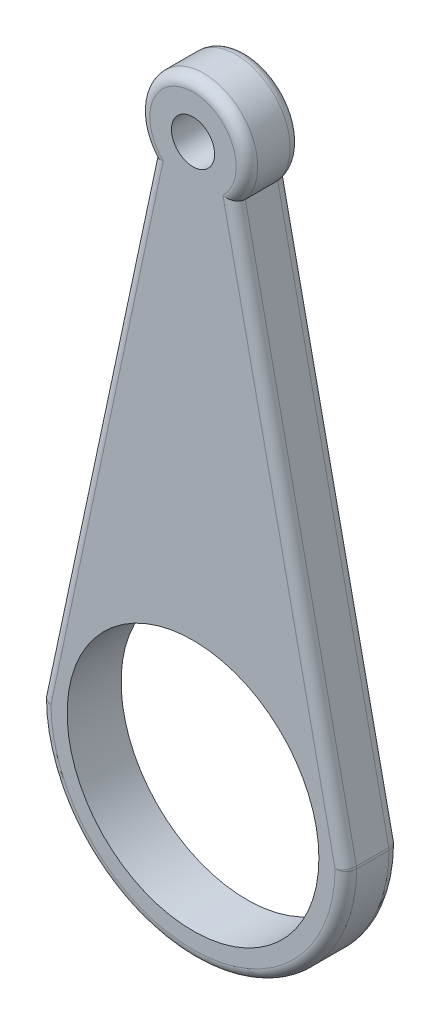
ISO-10303-21;
HEADER;
FILE_DESCRIPTION(('STEP AP214'),'2;1');
FILE_NAME('part.step','',(''),(''),'','','');
FILE_SCHEMA(('AUTOMOTIVE_DESIGN { 1 0 10303 214 1 1 1 1 }'));
ENDSEC;
DATA;
#1=APPLICATION_CONTEXT('core data for automotive mechanical design processes');
#2=APPLICATION_PROTOCOL_DEFINITION('international standard','automotive_design',2000,#1);
#3=PRODUCT_CONTEXT('',#1,'mechanical');
#4=PRODUCT('Part','Part','',(#3));
#5=PRODUCT_RELATED_PRODUCT_CATEGORY('part','',(#4));
#6=PRODUCT_DEFINITION_FORMATION('','',#4);
#7=PRODUCT_DEFINITION_CONTEXT('part definition',#1,'design');
#8=PRODUCT_DEFINITION('design','',#6,#7);
#9=PRODUCT_DEFINITION_SHAPE('','',#8);
#10=(LENGTH_UNIT() NAMED_UNIT(*) SI_UNIT(.MILLI.,.METRE.));
#11=(NAMED_UNIT(*) PLANE_ANGLE_UNIT() SI_UNIT($,.RADIAN.));
#12=(NAMED_UNIT(*) SI_UNIT($,.STERADIAN.) SOLID_ANGLE_UNIT());
#13=UNCERTAINTY_MEASURE_WITH_UNIT(LENGTH_MEASURE(1.E-05),#10,'distance_accuracy_value','');
#14=(GEOMETRIC_REPRESENTATION_CONTEXT(3) GLOBAL_UNCERTAINTY_ASSIGNED_CONTEXT((#13)) GLOBAL_UNIT_ASSIGNED_CONTEXT((#10,
#11,#12)) REPRESENTATION_CONTEXT('',''));
#15=CARTESIAN_POINT('',(0.,0.,0.));
#16=DIRECTION('',(0.,0.,1.));
#17=DIRECTION('',(1.,0.,0.));
#18=AXIS2_PLACEMENT_3D('',#15,#16,#17);
#19=CARTESIAN_POINT('',(40.6577526812567,8.6545731184832,7.5));
#20=DIRECTION('',(-0.978086399182027,-0.208199413388068,0.));
#21=DIRECTION('',(0.208199413388068,-0.978086399182028,0.));
#22=AXIS2_PLACEMENT_3D('',#19,#20,#21);
#23=PLANE('',#22);
#24=DIRECTION('',(0.,0.,-1.));
#25=VECTOR('',#24,1.);
#26=CARTESIAN_POINT('',(42.4330423898145,0.314555775054333,7.5));
#27=LINE('',#26,#25);
#28=CARTESIAN_POINT('',(42.4330423898145,0.314555775054333,4.5));
#29=VERTEX_POINT('',#28);
#30=CARTESIAN_POINT('',(42.4330423898145,0.314555775054333,-4.5));
#31=VERTEX_POINT('',#30);
#32=EDGE_CURVE('E150',#29,#31,#27,.T.);
#33=ORIENTED_EDGE('',*,*,#32,.T.);
#34=DIRECTION('',(-0.208199413388068,0.978086399182028,0.));
#35=VECTOR('',#34,1.);
#36=CARTESIAN_POINT('',(40.6577526812567,8.6545731184832,-4.5));
#37=LINE('',#36,#35);
#38=CARTESIAN_POINT('',(11.5446879540058,145.422934685164,-4.5));
#39=VERTEX_POINT('',#38);
#40=EDGE_CURVE('E135',#31,#39,#37,.T.);
#41=ORIENTED_EDGE('',*,*,#40,.T.);
#42=DIRECTION('',(0.,0.,-1.));
#43=VECTOR('',#42,1.);
#44=CARTESIAN_POINT('',(11.5446879540058,145.422934685164,7.5));
#45=LINE('',#44,#43);
#46=CARTESIAN_POINT('',(11.5446879540058,145.422934685164,4.5));
#47=VERTEX_POINT('',#46);
#48=EDGE_CURVE('E118',#47,#39,#45,.T.);
#49=ORIENTED_EDGE('',*,*,#48,.F.);
#50=DIRECTION('',(-0.208199413388068,0.978086399182028,0.));
#51=VECTOR('',#50,1.);
#52=CARTESIAN_POINT('',(42.5,0.,4.5));
#53=LINE('',#52,#51);
#54=EDGE_CURVE('E132',#47,#29,#53,.F.);
#55=ORIENTED_EDGE('',*,*,#54,.T.);
#56=EDGE_LOOP('',(#33,#41,#49,#55));
#57=FACE_BOUND('',#56,.T.);
#58=ADVANCED_FACE('F37',(#57),#23,.F.);
#59=CARTESIAN_POINT('',(0.,155.,7.5));
#60=DIRECTION('',(0.,0.,-1.));
#61=DIRECTION('',(-1.,0.,0.));
#62=AXIS2_PLACEMENT_3D('',#59,#60,#61);
#63=CYLINDRICAL_SURFACE('',#62,15.);
#64=ORIENTED_EDGE('',*,*,#48,.T.);
#65=CARTESIAN_POINT('',(0.,155.,-4.5));
#66=DIRECTION('',(0.,0.,1.));
#67=DIRECTION('',(1.,0.,0.));
#68=AXIS2_PLACEMENT_3D('',#65,#66,#67);
#69=CIRCLE('',#68,15.);
#70=CARTESIAN_POINT('',(-11.5446879540058,145.422934685164,-4.5));
#71=VERTEX_POINT('',#70);
#72=EDGE_CURVE('E126',#39,#71,#69,.T.);
#73=ORIENTED_EDGE('',*,*,#72,.T.);
#74=DIRECTION('',(0.,0.,-1.));
#75=VECTOR('',#74,1.);
#76=CARTESIAN_POINT('',(-11.5446879540058,145.422934685164,7.5));
#77=LINE('',#76,#75);
#78=CARTESIAN_POINT('',(-11.5446879540058,145.422934685164,4.5));
#79=VERTEX_POINT('',#78);
#80=EDGE_CURVE('E121',#79,#71,#77,.T.);
#81=ORIENTED_EDGE('',*,*,#80,.F.);
#82=CARTESIAN_POINT('',(0.,155.,4.5));
#83=DIRECTION('',(0.,0.,1.));
#84=DIRECTION('',(1.,0.,0.));
#85=AXIS2_PLACEMENT_3D('',#82,#83,#84);
#86=CIRCLE('',#85,15.);
#87=EDGE_CURVE('E115',#79,#47,#86,.F.);
#88=ORIENTED_EDGE('',*,*,#87,.T.);
#89=EDGE_LOOP('',(#64,#73,#81,#88));
#90=FACE_BOUND('',#89,.T.);
#91=ADVANCED_FACE('F117',(#90),#63,.T.);
#92=CARTESIAN_POINT('',(-40.6577526812567,8.6545731184832,7.5));
#93=DIRECTION('',(-0.978086399182027,0.208199413388068,0.));
#94=DIRECTION('',(-0.208199413388068,-0.978086399182028,0.));
#95=AXIS2_PLACEMENT_3D('',#92,#93,#94);
#96=PLANE('',#95);
#97=ORIENTED_EDGE('',*,*,#80,.T.);
#98=DIRECTION('',(0.208199413388068,0.978086399182028,0.));
#99=VECTOR('',#98,1.);
#100=CARTESIAN_POINT('',(-42.5,0.,-4.5));
#101=LINE('',#100,#99);
#102=CARTESIAN_POINT('',(-42.4330423898145,0.314555775054333,-4.5));
#103=VERTEX_POINT('',#102);
#104=EDGE_CURVE('E169',#71,#103,#101,.F.);
#105=ORIENTED_EDGE('',*,*,#104,.T.);
#106=DIRECTION('',(0.,0.,1.));
#107=VECTOR('',#106,1.);
#108=CARTESIAN_POINT('',(-42.4330423898145,0.314555775054333,7.5));
#109=LINE('',#108,#107);
#110=CARTESIAN_POINT('',(-42.4330423898145,0.314555775054333,4.5));
#111=VERTEX_POINT('',#110);
#112=EDGE_CURVE('E167',#103,#111,#109,.T.);
#113=ORIENTED_EDGE('',*,*,#112,.T.);
#114=DIRECTION('',(0.208199413388068,0.978086399182028,0.));
#115=VECTOR('',#114,1.);
#116=CARTESIAN_POINT('',(-40.6577526812567,8.6545731184832,4.5));
#117=LINE('',#116,#115);
#118=EDGE_CURVE('E165',#111,#79,#117,.T.);
#119=ORIENTED_EDGE('',*,*,#118,.T.);
#120=EDGE_LOOP('',(#97,#105,#113,#119));
#121=FACE_BOUND('',#120,.T.);
#122=ADVANCED_FACE('F267',(#121),#96,.T.);
#123=CARTESIAN_POINT('',(0.,0.,7.5));
#124=DIRECTION('',(0.,0.,-1.));
#125=DIRECTION('',(-1.,0.,0.));
#126=AXIS2_PLACEMENT_3D('',#123,#124,#125);
#127=CYLINDRICAL_SURFACE('',#126,35.);
#128=CARTESIAN_POINT('',(0.,0.,7.5));
#129=DIRECTION('',(0.,0.,1.));
#130=DIRECTION('',(1.,0.,0.));
#131=AXIS2_PLACEMENT_3D('',#128,#129,#130);
#132=CIRCLE('',#131,35.);
#133=CARTESIAN_POINT('',(35.,0.,7.5));
#134=VERTEX_POINT('',#133);
#135=EDGE_CURVE('E341',#134,#134,#132,.T.);
#136=ORIENTED_EDGE('',*,*,#135,.T.);
#137=EDGE_LOOP('',(#136));
#138=FACE_BOUND('',#137,.T.);
#139=CARTESIAN_POINT('',(0.,0.,-7.5));
#140=DIRECTION('',(0.,0.,1.));
#141=DIRECTION('',(1.,0.,0.));
#142=AXIS2_PLACEMENT_3D('',#139,#140,#141);
#143=CIRCLE('',#142,35.);
#144=CARTESIAN_POINT('',(35.,0.,-7.5));
#145=VERTEX_POINT('',#144);
#146=EDGE_CURVE('E343',#145,#145,#143,.T.);
#147=ORIENTED_EDGE('',*,*,#146,.F.);
#148=EDGE_LOOP('',(#147));
#149=FACE_BOUND('',#148,.T.);
#150=ADVANCED_FACE('F271',(#138,#149),#127,.F.);
#151=CARTESIAN_POINT('',(0.,155.,7.5));
#152=DIRECTION('',(0.,0.,-1.));
#153=DIRECTION('',(-1.,0.,0.));
#154=AXIS2_PLACEMENT_3D('',#151,#152,#153);
#155=CYLINDRICAL_SURFACE('',#154,6.);
#156=CARTESIAN_POINT('',(0.,155.,7.5));
#157=DIRECTION('',(0.,0.,1.));
#158=DIRECTION('',(1.,0.,0.));
#159=AXIS2_PLACEMENT_3D('',#156,#157,#158);
#160=CIRCLE('',#159,6.);
#161=CARTESIAN_POINT('',(6.,155.,7.5));
#162=VERTEX_POINT('',#161);
#163=EDGE_CURVE('E338',#162,#162,#160,.T.);
#164=ORIENTED_EDGE('',*,*,#163,.T.);
#165=EDGE_LOOP('',(#164));
#166=FACE_BOUND('',#165,.T.);
#167=CARTESIAN_POINT('',(0.,155.,-7.5));
#168=DIRECTION('',(0.,0.,1.));
#169=DIRECTION('',(1.,0.,0.));
#170=AXIS2_PLACEMENT_3D('',#167,#168,#169);
#171=CIRCLE('',#170,6.);
#172=CARTESIAN_POINT('',(6.,155.,-7.5));
#173=VERTEX_POINT('',#172);
#174=EDGE_CURVE('E346',#173,#173,#171,.T.);
#175=ORIENTED_EDGE('',*,*,#174,.F.);
#176=EDGE_LOOP('',(#175));
#177=FACE_BOUND('',#176,.T.);
#178=ADVANCED_FACE('F274',(#166,#177),#155,.F.);
#179=CARTESIAN_POINT('',(0.,0.,7.5));
#180=DIRECTION('',(0.,0.,-1.));
#181=DIRECTION('',(-1.,0.,0.));
#182=AXIS2_PLACEMENT_3D('',#179,#180,#181);
#183=CYLINDRICAL_SURFACE('',#182,42.5);
#184=DIRECTION('',(0.,0.,-1.));
#185=VECTOR('',#184,1.);
#186=CARTESIAN_POINT('',(-42.4986907764914,-0.333589994105561,7.5));
#187=LINE('',#186,#185);
#188=CARTESIAN_POINT('',(-42.4986907764914,-0.333589994105561,4.5));
#189=VERTEX_POINT('',#188);
#190=CARTESIAN_POINT('',(-42.4986907764914,-0.333589994105561,-4.5));
#191=VERTEX_POINT('',#190);
#192=EDGE_CURVE('E158',#189,#191,#187,.T.);
#193=ORIENTED_EDGE('',*,*,#192,.T.);
#194=CARTESIAN_POINT('',(0.,0.,-4.5));
#195=DIRECTION('',(0.,0.,1.));
#196=DIRECTION('',(1.,0.,0.));
#197=AXIS2_PLACEMENT_3D('',#194,#195,#196);
#198=CIRCLE('',#197,42.5);
#199=CARTESIAN_POINT('',(42.4986907764914,-0.333589994105561,-4.5));
#200=VERTEX_POINT('',#199);
#201=EDGE_CURVE('E163',#191,#200,#198,.T.);
#202=ORIENTED_EDGE('',*,*,#201,.T.);
#203=DIRECTION('',(0.,0.,-1.));
#204=VECTOR('',#203,1.);
#205=CARTESIAN_POINT('',(42.4986907764914,-0.333589994105561,7.5));
#206=LINE('',#205,#204);
#207=CARTESIAN_POINT('',(42.4986907764914,-0.333589994105561,4.5));
#208=VERTEX_POINT('',#207);
#209=EDGE_CURVE('E160',#200,#208,#206,.F.);
#210=ORIENTED_EDGE('',*,*,#209,.T.);
#211=CARTESIAN_POINT('',(0.,0.,4.5));
#212=DIRECTION('',(0.,0.,1.));
#213=DIRECTION('',(1.,0.,0.));
#214=AXIS2_PLACEMENT_3D('',#211,#212,#213);
#215=CIRCLE('',#214,42.5);
#216=EDGE_CURVE('E156',#208,#189,#215,.F.);
#217=ORIENTED_EDGE('',*,*,#216,.T.);
#218=EDGE_LOOP('',(#193,#202,#210,#217));
#219=FACE_BOUND('',#218,.T.);
#220=ADVANCED_FACE('F278',(#219),#183,.T.);
#221=CARTESIAN_POINT('',(0.,0.,7.5));
#222=DIRECTION('',(0.,0.,1.));
#223=DIRECTION('',(1.,0.,0.));
#224=AXIS2_PLACEMENT_3D('',#221,#222,#223);
#225=PLANE('',#224);
#226=CARTESIAN_POINT('',(0.,155.,7.5));
#227=DIRECTION('',(0.,0.,1.));
#228=DIRECTION('',(1.,0.,0.));
#229=AXIS2_PLACEMENT_3D('',#226,#227,#228);
#230=CIRCLE('',#229,12.);
#231=CARTESIAN_POINT('',(8.2864312750157,146.320423010052,7.5));
#232=VERTEX_POINT('',#231);
#233=CARTESIAN_POINT('',(-8.2864312750157,146.320423010052,7.5));
#234=VERTEX_POINT('',#233);
#235=EDGE_CURVE('E141',#232,#234,#230,.T.);
#236=ORIENTED_EDGE('',*,*,#235,.T.);
#237=DIRECTION('',(0.208199413388068,0.978086399182028,0.));
#238=VECTOR('',#237,1.);
#239=CARTESIAN_POINT('',(-37.7234934837107,8.029974878319,7.5));
#240=LINE('',#239,#238);
#241=CARTESIAN_POINT('',(-39.4987831922684,-0.310042465110075,7.5));
#242=VERTEX_POINT('',#241);
#243=EDGE_CURVE('E11',#234,#242,#240,.F.);
#244=ORIENTED_EDGE('',*,*,#243,.T.);
#245=CARTESIAN_POINT('',(0.,0.,7.5));
#246=DIRECTION('',(0.,0.,1.));
#247=DIRECTION('',(1.,0.,0.));
#248=AXIS2_PLACEMENT_3D('',#245,#246,#247);
#249=CIRCLE('',#248,39.5);
#250=CARTESIAN_POINT('',(39.4987831922685,-0.310042465110052,7.5));
#251=VERTEX_POINT('',#250);
#252=EDGE_CURVE('E46',#242,#251,#249,.T.);
#253=ORIENTED_EDGE('',*,*,#252,.T.);
#254=DIRECTION('',(-0.208199413388068,0.978086399182028,0.));
#255=VECTOR('',#254,1.);
#256=CARTESIAN_POINT('',(8.61042875645971,144.798336445,7.5));
#257=LINE('',#256,#255);
#258=EDGE_CURVE('E181',#251,#232,#257,.T.);
#259=ORIENTED_EDGE('',*,*,#258,.T.);
#260=EDGE_LOOP('',(#236,#244,#253,#259));
#261=FACE_BOUND('',#260,.T.);
#262=ORIENTED_EDGE('',*,*,#163,.F.);
#263=EDGE_LOOP('',(#262));
#264=FACE_BOUND('',#263,.T.);
#265=ORIENTED_EDGE('',*,*,#135,.F.);
#266=EDGE_LOOP('',(#265));
#267=FACE_BOUND('',#266,.T.);
#268=ADVANCED_FACE('F331',(#261,#264,#267),#225,.T.);
#269=CARTESIAN_POINT('',(0.,0.,-7.5));
#270=DIRECTION('',(0.,0.,1.));
#271=DIRECTION('',(1.,0.,0.));
#272=AXIS2_PLACEMENT_3D('',#269,#270,#271);
#273=PLANE('',#272);
#274=DIRECTION('',(-0.208199413388068,0.978086399182028,0.));
#275=VECTOR('',#274,1.);
#276=CARTESIAN_POINT('',(37.7234934837107,8.029974878319,-7.5));
#277=LINE('',#276,#275);
#278=CARTESIAN_POINT('',(8.2864312750157,146.320423010052,-7.5));
#279=VERTEX_POINT('',#278);
#280=CARTESIAN_POINT('',(39.4987831922685,-0.310042465110065,-7.5));
#281=VERTEX_POINT('',#280);
#282=EDGE_CURVE('E171',#279,#281,#277,.F.);
#283=ORIENTED_EDGE('',*,*,#282,.T.);
#284=CARTESIAN_POINT('',(0.,0.,-7.5));
#285=DIRECTION('',(0.,0.,1.));
#286=DIRECTION('',(1.,0.,0.));
#287=AXIS2_PLACEMENT_3D('',#284,#285,#286);
#288=CIRCLE('',#287,39.5);
#289=CARTESIAN_POINT('',(-39.4987831922685,-0.310042465110052,-7.5));
#290=VERTEX_POINT('',#289);
#291=EDGE_CURVE('E127',#281,#290,#288,.F.);
#292=ORIENTED_EDGE('',*,*,#291,.T.);
#293=DIRECTION('',(0.208199413388068,0.978086399182028,0.));
#294=VECTOR('',#293,1.);
#295=CARTESIAN_POINT('',(-8.61042875645971,144.798336445,-7.5));
#296=LINE('',#295,#294);
#297=CARTESIAN_POINT('',(-8.2864312750157,146.320423010052,-7.5));
#298=VERTEX_POINT('',#297);
#299=EDGE_CURVE('E175',#290,#298,#296,.T.);
#300=ORIENTED_EDGE('',*,*,#299,.T.);
#301=CARTESIAN_POINT('',(0.,155.,-7.5));
#302=DIRECTION('',(0.,0.,1.));
#303=DIRECTION('',(1.,0.,0.));
#304=AXIS2_PLACEMENT_3D('',#301,#302,#303);
#305=CIRCLE('',#304,12.);
#306=EDGE_CURVE('E173',#298,#279,#305,.F.);
#307=ORIENTED_EDGE('',*,*,#306,.T.);
#308=EDGE_LOOP('',(#283,#292,#300,#307));
#309=FACE_BOUND('',#308,.T.);
#310=ORIENTED_EDGE('',*,*,#174,.T.);
#311=EDGE_LOOP('',(#310));
#312=FACE_BOUND('',#311,.T.);
#313=ORIENTED_EDGE('',*,*,#146,.T.);
#314=EDGE_LOOP('',(#313));
#315=FACE_BOUND('',#314,.T.);
#316=ADVANCED_FACE('F251',(#309,#312,#315),#273,.F.);
#317=CARTESIAN_POINT('',(-37.7234934837107,8.029974878319,4.5));
#318=DIRECTION('',(0.208199413388068,0.978086399182028,0.));
#319=DIRECTION('',(-0.978086399182028,0.208199413388068,0.));
#320=AXIS2_PLACEMENT_3D('',#317,#318,#319);
#321=CYLINDRICAL_SURFACE('',#320,3.);
#322=CARTESIAN_POINT('',(-11.5446879540058,145.422934685164,4.5));
#323=CARTESIAN_POINT('',(-11.5447005160332,145.422932668083,4.57812613453918));
#324=CARTESIAN_POINT('',(-11.541395448324,145.423745289459,4.65624609487694));
#325=CARTESIAN_POINT('',(-11.5282463065438,145.426983948566,4.81188221159863));
#326=CARTESIAN_POINT('',(-11.5184037689101,145.4294096072,4.88939850552661));
#327=CARTESIAN_POINT('',(-11.4923175107118,145.435848212976,5.04302777117437));
#328=CARTESIAN_POINT('',(-11.476094300057,145.439856074467,5.11914442926921));
#329=CARTESIAN_POINT('',(-11.437444541903,145.44942543331,5.26966596521091));
#330=CARTESIAN_POINT('',(-11.415017848288,145.454986967255,5.34407080269311));
#331=CARTESIAN_POINT('',(-11.3387864892467,145.473943006722,5.56387808311575));
#332=CARTESIAN_POINT('',(-11.2759947927023,145.489617678536,5.70608013602633));
#333=CARTESIAN_POINT('',(-11.1290340557996,145.526610914237,5.97809127735615));
#334=CARTESIAN_POINT('',(-11.0448543415216,145.547932296402,6.10789413318651));
#335=CARTESIAN_POINT('',(-10.8546978253316,145.596594560418,6.35698884317907));
#336=CARTESIAN_POINT('',(-10.7480303968863,145.624128796845,6.4757148956955));
#337=CARTESIAN_POINT('',(-10.5185964371798,145.684097700812,6.69490782302807));
#338=CARTESIAN_POINT('',(-10.3958257275378,145.71653364055,6.79536994263217));
#339=CARTESIAN_POINT('',(-10.1256062779565,145.788932857223,6.98530049299647));
#340=CARTESIAN_POINT('',(-9.97692266267522,145.829317048517,7.07284890667398));
#341=CARTESIAN_POINT('',(-9.66884761889392,145.914416620096,7.22379317860076));
#342=CARTESIAN_POINT('',(-9.50944750459491,145.95913552699,7.28716916042523));
#343=CARTESIAN_POINT('',(-9.17630756106457,146.054292573141,7.39192437475818));
#344=CARTESIAN_POINT('',(-9.00224623267999,146.104901462008,7.43211609128317));
#345=CARTESIAN_POINT('',(-8.6512026421683,146.209007818022,7.48583947863652));
#346=CARTESIAN_POINT('',(-8.47422691397971,146.262499309144,7.49942427820718));
#347=CARTESIAN_POINT('',(-8.29399465184258,146.318088714108,7.4999940403055));
#348=CARTESIAN_POINT('',(-8.29021283209869,146.319255650878,7.50000001150523));
#349=CARTESIAN_POINT('',(-8.28643127501572,146.320423010052,7.5));
#350=B_SPLINE_CURVE_WITH_KNOTS('',3,(#322,#323,#324,#325,#326,#327,#328,#329,#330,#331,#332,
#333,#334,#335,#336,#337,#338,#339,#340,#341,#342,#343,#344,#345,#346,#347,#348,#349),
.UNSPECIFIED.,.F.,.F.,(4,2,2,2,2,2,2,2,2,2,2,2,2,4),(0.,0.234293806160386,0.468532568026192,
0.702024471425572,0.935521874922896,1.40189440751048,1.86850014705475,2.35235160974418,
2.83632886853061,3.36578260879122,3.89567077268189,4.45072254056351,5.00466484548147,
5.01653813141621),.UNSPECIFIED.);
#351=EDGE_CURVE('E234',#79,#234,#350,.T.);
#352=ORIENTED_EDGE('',*,*,#351,.F.);
#353=ORIENTED_EDGE('',*,*,#118,.F.);
#354=CARTESIAN_POINT('',(-39.4987831922685,-0.310042465110075,4.5));
#355=DIRECTION('',(-0.208199413388136,-0.978086399182013,0.));
#356=DIRECTION('',(0.978086399182013,-0.208199413388136,0.));
#357=AXIS2_PLACEMENT_3D('',#354,#355,#356);
#358=CIRCLE('',#357,3.);
#359=EDGE_CURVE('E328',#242,#111,#358,.T.);
#360=ORIENTED_EDGE('',*,*,#359,.F.);
#361=ORIENTED_EDGE('',*,*,#243,.F.);
#362=EDGE_LOOP('',(#352,#353,#360,#361));
#363=FACE_BOUND('',#362,.T.);
#364=ADVANCED_FACE('F246',(#363),#321,.T.);
#365=CARTESIAN_POINT('',(-37.7234934837107,8.029974878319,-4.5));
#366=DIRECTION('',(-0.208199413388068,-0.978086399182028,0.));
#367=DIRECTION('',(0.978086399182028,-0.208199413388068,0.));
#368=AXIS2_PLACEMENT_3D('',#365,#366,#367);
#369=CYLINDRICAL_SURFACE('',#368,3.);
#370=CARTESIAN_POINT('',(-39.4987831922685,-0.310042465109872,-4.5));
#371=DIRECTION('',(-0.208199413388068,-0.978086399182027,0.));
#372=DIRECTION('',(0.978086399182028,-0.208199413388068,0.));
#373=AXIS2_PLACEMENT_3D('',#370,#371,#372);
#374=CIRCLE('',#373,3.);
#375=EDGE_CURVE('E235',#103,#290,#374,.T.);
#376=ORIENTED_EDGE('',*,*,#375,.F.);
#377=ORIENTED_EDGE('',*,*,#104,.F.);
#378=CARTESIAN_POINT('',(-11.5446879540058,145.422934685164,-4.5));
#379=CARTESIAN_POINT('',(-11.5447005160332,145.422932668083,-4.57812613453918));
#380=CARTESIAN_POINT('',(-11.541395448324,145.423745289459,-4.65624609487694));
#381=CARTESIAN_POINT('',(-11.5282463065438,145.426983948566,-4.81188221159863));
#382=CARTESIAN_POINT('',(-11.5184037689101,145.4294096072,-4.88939850552661));
#383=CARTESIAN_POINT('',(-11.4923175107118,145.435848212976,-5.04302777117437));
#384=CARTESIAN_POINT('',(-11.476094300057,145.439856074467,-5.11914442926921));
#385=CARTESIAN_POINT('',(-11.437444541903,145.44942543331,-5.26966596521091));
#386=CARTESIAN_POINT('',(-11.415017848288,145.454986967255,-5.34407080269311));
#387=CARTESIAN_POINT('',(-11.3387864892467,145.473943006722,-5.56387808311575));
#388=CARTESIAN_POINT('',(-11.2759947927023,145.489617678536,-5.70608013602634));
#389=CARTESIAN_POINT('',(-11.1290340557996,145.526610914237,-5.97809127735615));
#390=CARTESIAN_POINT('',(-11.0448543415216,145.547932296402,-6.10789413318652));
#391=CARTESIAN_POINT('',(-10.8546978253316,145.596594560418,-6.35698884317908));
#392=CARTESIAN_POINT('',(-10.7480303968863,145.624128796845,-6.47571489569551));
#393=CARTESIAN_POINT('',(-10.5185964371798,145.684097700812,-6.69490782302807));
#394=CARTESIAN_POINT('',(-10.3958257275378,145.71653364055,-6.79536994263217));
#395=CARTESIAN_POINT('',(-10.1256062779565,145.788932857223,-6.98530049299647));
#396=CARTESIAN_POINT('',(-9.97692266267525,145.829317048517,-7.07284890667397));
#397=CARTESIAN_POINT('',(-9.66884761889391,145.914416620096,-7.22379317860075));
#398=CARTESIAN_POINT('',(-9.50944750459482,145.95913552699,-7.28716916042523));
#399=CARTESIAN_POINT('',(-9.17630756106464,146.054292573141,-7.39192437475818));
#400=CARTESIAN_POINT('',(-9.00224623268032,146.104901462009,-7.43211609128317));
#401=CARTESIAN_POINT('',(-8.65120264216788,146.20900781802,-7.48583947863653));
#402=CARTESIAN_POINT('',(-8.47422691397831,146.262499309139,-7.49942427820719));
#403=CARTESIAN_POINT('',(-8.29399465184251,146.318088714108,-7.4999940403055));
#404=CARTESIAN_POINT('',(-8.29021283209866,146.319255650878,-7.50000001150523));
#405=CARTESIAN_POINT('',(-8.28643127501572,146.320423010052,-7.5));
#406=B_SPLINE_CURVE_WITH_KNOTS('',3,(#378,#379,#380,#381,#382,#383,#384,#385,#386,#387,#388,
#389,#390,#391,#392,#393,#394,#395,#396,#397,#398,#399,#400,#401,#402,#403,#404,#405),
.UNSPECIFIED.,.F.,.F.,(4,2,2,2,2,2,2,2,2,2,2,2,2,4),(0.,0.234293806160386,0.468532568026194,
0.702024471425571,0.935521874922895,1.40189440751049,1.86850014705474,2.35235160974418,
2.83632886853061,3.3657826087912,3.89567077268189,4.45072254056357,5.00466484548148,
5.01653813141621),.UNSPECIFIED.);
#407=EDGE_CURVE('E225',#298,#71,#406,.F.);
#408=ORIENTED_EDGE('',*,*,#407,.F.);
#409=ORIENTED_EDGE('',*,*,#299,.F.);
#410=EDGE_LOOP('',(#376,#377,#408,#409));
#411=FACE_BOUND('',#410,.T.);
#412=ADVANCED_FACE('F242',(#411),#369,.T.);
#413=CARTESIAN_POINT('',(-39.4987831922684,-0.310042465109874,7.5));
#414=DIRECTION('',(0.,0.,-1.));
#415=DIRECTION('',(-1.,0.,0.));
#416=AXIS2_PLACEMENT_3D('',#413,#414,#415);
#417=CYLINDRICAL_SURFACE('',#416,3.);
#418=CARTESIAN_POINT('',(-39.4987831922685,-0.310042465109872,4.5));
#419=DIRECTION('',(0.,0.,1.));
#420=DIRECTION('',(1.,0.,0.));
#421=AXIS2_PLACEMENT_3D('',#418,#419,#420);
#422=CIRCLE('',#421,3.);
#423=EDGE_CURVE('E41',#111,#189,#422,.T.);
#424=ORIENTED_EDGE('',*,*,#423,.F.);
#425=ORIENTED_EDGE('',*,*,#112,.F.);
#426=CARTESIAN_POINT('',(-39.4987831922684,-0.310042465109874,-4.5));
#427=DIRECTION('',(0.,0.,-1.));
#428=DIRECTION('',(0.,1.,0.));
#429=AXIS2_PLACEMENT_3D('',#426,#427,#428);
#430=CIRCLE('',#429,3.);
#431=EDGE_CURVE('E309',#191,#103,#430,.T.);
#432=ORIENTED_EDGE('',*,*,#431,.F.);
#433=ORIENTED_EDGE('',*,*,#192,.F.);
#434=EDGE_LOOP('',(#424,#425,#432,#433));
#435=FACE_BOUND('',#434,.T.);
#436=ADVANCED_FACE('F39',(#435),#417,.T.);
#437=CARTESIAN_POINT('',(-39.4987831922684,-0.310042465109839,4.5));
#438=DIRECTION('',(0.,0.,1.));
#439=DIRECTION('',(0.,-1.,0.));
#440=AXIS2_PLACEMENT_3D('',#437,#438,#439);
#441=SPHERICAL_SURFACE('',#440,3.);
#442=ORIENTED_EDGE('',*,*,#359,.T.);
#443=ORIENTED_EDGE('',*,*,#423,.T.);
#444=CARTESIAN_POINT('',(-39.4987831922684,-0.310042465109874,4.5));
#445=DIRECTION('',(-0.00784917633189555,0.999969194740973,0.));
#446=DIRECTION('',(-0.999969194740974,-0.00784917633189555,0.));
#447=AXIS2_PLACEMENT_3D('',#444,#445,#446);
#448=CIRCLE('',#447,3.);
#449=EDGE_CURVE('E143',#242,#189,#448,.F.);
#450=ORIENTED_EDGE('',*,*,#449,.F.);
#451=EDGE_LOOP('',(#442,#443,#450));
#452=FACE_BOUND('',#451,.T.);
#453=ADVANCED_FACE('F253',(#452),#441,.T.);
#454=CARTESIAN_POINT('',(0.,155.,4.5));
#455=DIRECTION('',(0.,0.,1.));
#456=DIRECTION('',(1.,0.,0.));
#457=AXIS2_PLACEMENT_3D('',#454,#455,#456);
#458=TOROIDAL_SURFACE('',#457,12.,3.);
#459=ORIENTED_EDGE('',*,*,#351,.T.);
#460=ORIENTED_EDGE('',*,*,#235,.F.);
#461=CARTESIAN_POINT('',(11.5446879540058,145.422934685164,4.5));
#462=CARTESIAN_POINT('',(11.5447005160332,145.422932668083,4.57812613453918));
#463=CARTESIAN_POINT('',(11.541395448324,145.423745289459,4.65624609487694));
#464=CARTESIAN_POINT('',(11.5282463065438,145.426983948566,4.81188221159863));
#465=CARTESIAN_POINT('',(11.5184037689101,145.4294096072,4.88939850552661));
#466=CARTESIAN_POINT('',(11.4923175107118,145.435848212976,5.04302777117437));
#467=CARTESIAN_POINT('',(11.476094300057,145.439856074467,5.11914442926921));
#468=CARTESIAN_POINT('',(11.437444541903,145.44942543331,5.26966596521091));
#469=CARTESIAN_POINT('',(11.415017848288,145.454986967255,5.34407080269311));
#470=CARTESIAN_POINT('',(11.3387864892467,145.473943006722,5.56387808311575));
#471=CARTESIAN_POINT('',(11.2759947927023,145.489617678536,5.70608013602633));
#472=CARTESIAN_POINT('',(11.1290340557996,145.526610914237,5.97809127735615));
#473=CARTESIAN_POINT('',(11.0448543415216,145.547932296402,6.10789413318651));
#474=CARTESIAN_POINT('',(10.8546978253316,145.596594560418,6.35698884317907));
#475=CARTESIAN_POINT('',(10.7480303968863,145.624128796845,6.4757148956955));
#476=CARTESIAN_POINT('',(10.5185964371798,145.684097700812,6.69490782302806));
#477=CARTESIAN_POINT('',(10.3958257275378,145.71653364055,6.79536994263217));
#478=CARTESIAN_POINT('',(10.1256062779565,145.788932857223,6.98530049299647));
#479=CARTESIAN_POINT('',(9.97692266267522,145.829317048517,7.07284890667398));
#480=CARTESIAN_POINT('',(9.66884761889392,145.914416620096,7.22379317860076));
#481=CARTESIAN_POINT('',(9.50944750459491,145.95913552699,7.28716916042523));
#482=CARTESIAN_POINT('',(9.17630756106457,146.054292573141,7.39192437475818));
#483=CARTESIAN_POINT('',(9.00224623267999,146.104901462008,7.43211609128317));
#484=CARTESIAN_POINT('',(8.6512026421683,146.209007818022,7.48583947863652));
#485=CARTESIAN_POINT('',(8.47422691397971,146.262499309144,7.49942427820718));
#486=CARTESIAN_POINT('',(8.29399465184258,146.318088714108,7.4999940403055));
#487=CARTESIAN_POINT('',(8.29021283209869,146.319255650878,7.50000001150523));
#488=CARTESIAN_POINT('',(8.28643127501572,146.320423010052,7.5));
#489=B_SPLINE_CURVE_WITH_KNOTS('',3,(#461,#462,#463,#464,#465,#466,#467,#468,#469,#470,#471,
#472,#473,#474,#475,#476,#477,#478,#479,#480,#481,#482,#483,#484,#485,#486,#487,#488),
.UNSPECIFIED.,.F.,.F.,(4,2,2,2,2,2,2,2,2,2,2,2,2,4),(0.,0.234293806160386,0.468532568026192,
0.702024471425572,0.935521874922896,1.40189440751048,1.86850014705475,2.35235160974418,
2.83632886853061,3.36578260879122,3.89567077268189,4.45072254056351,5.00466484548147,
5.01653813141621),.UNSPECIFIED.);
#490=EDGE_CURVE('E139',#47,#232,#489,.T.);
#491=ORIENTED_EDGE('',*,*,#490,.F.);
#492=ORIENTED_EDGE('',*,*,#87,.F.);
#493=EDGE_LOOP('',(#459,#460,#491,#492));
#494=FACE_BOUND('',#493,.T.);
#495=ADVANCED_FACE('F140',(#494),#458,.T.);
#496=CARTESIAN_POINT('',(0.,155.,-4.5));
#497=DIRECTION('',(0.,0.,1.));
#498=DIRECTION('',(1.,0.,0.));
#499=AXIS2_PLACEMENT_3D('',#496,#497,#498);
#500=TOROIDAL_SURFACE('',#499,12.,3.);
#501=ORIENTED_EDGE('',*,*,#407,.T.);
#502=ORIENTED_EDGE('',*,*,#72,.F.);
#503=CARTESIAN_POINT('',(11.5446879540058,145.422934685164,-4.5));
#504=CARTESIAN_POINT('',(11.5447005160332,145.422932668083,-4.57812613453918));
#505=CARTESIAN_POINT('',(11.541395448324,145.423745289459,-4.65624609487694));
#506=CARTESIAN_POINT('',(11.5282463065438,145.426983948566,-4.81188221159863));
#507=CARTESIAN_POINT('',(11.5184037689101,145.4294096072,-4.88939850552661));
#508=CARTESIAN_POINT('',(11.4923175107118,145.435848212976,-5.04302777117437));
#509=CARTESIAN_POINT('',(11.476094300057,145.439856074467,-5.11914442926921));
#510=CARTESIAN_POINT('',(11.437444541903,145.44942543331,-5.26966596521091));
#511=CARTESIAN_POINT('',(11.415017848288,145.454986967255,-5.34407080269311));
#512=CARTESIAN_POINT('',(11.3387864892467,145.473943006722,-5.56387808311575));
#513=CARTESIAN_POINT('',(11.2759947927023,145.489617678536,-5.70608013602633));
#514=CARTESIAN_POINT('',(11.1290340557996,145.526610914237,-5.97809127735615));
#515=CARTESIAN_POINT('',(11.0448543415216,145.547932296402,-6.10789413318651));
#516=CARTESIAN_POINT('',(10.8546978253316,145.596594560418,-6.35698884317908));
#517=CARTESIAN_POINT('',(10.7480303968863,145.624128796845,-6.47571489569551));
#518=CARTESIAN_POINT('',(10.5185964371798,145.684097700812,-6.69490782302807));
#519=CARTESIAN_POINT('',(10.3958257275378,145.71653364055,-6.79536994263217));
#520=CARTESIAN_POINT('',(10.1256062779565,145.788932857223,-6.98530049299648));
#521=CARTESIAN_POINT('',(9.97692266267522,145.829317048517,-7.07284890667398));
#522=CARTESIAN_POINT('',(9.66884761889392,145.914416620096,-7.22379317860076));
#523=CARTESIAN_POINT('',(9.50944750459491,145.95913552699,-7.28716916042523));
#524=CARTESIAN_POINT('',(9.17630756106457,146.054292573141,-7.39192437475818));
#525=CARTESIAN_POINT('',(9.00224623267999,146.104901462008,-7.43211609128317));
#526=CARTESIAN_POINT('',(8.65120264216829,146.209007818022,-7.48583947863653));
#527=CARTESIAN_POINT('',(8.4742269139797,146.262499309144,-7.49942427820718));
#528=CARTESIAN_POINT('',(8.29399465184257,146.318088714108,-7.4999940403055));
#529=CARTESIAN_POINT('',(8.29021283209869,146.319255650878,-7.50000001150523));
#530=CARTESIAN_POINT('',(8.28643127501572,146.320423010052,-7.5));
#531=B_SPLINE_CURVE_WITH_KNOTS('',3,(#503,#504,#505,#506,#507,#508,#509,#510,#511,#512,#513,
#514,#515,#516,#517,#518,#519,#520,#521,#522,#523,#524,#525,#526,#527,#528,#529,#530),
.UNSPECIFIED.,.F.,.F.,(4,2,2,2,2,2,2,2,2,2,2,2,2,4),(0.,0.234293806160386,0.468532568026192,
0.702024471425572,0.935521874922896,1.40189440751048,1.86850014705474,2.35235160974418,
2.83632886853062,3.36578260879123,3.89567077268189,4.45072254056352,5.00466484548148,
5.01653813141621),.UNSPECIFIED.);
#532=EDGE_CURVE('E144',#279,#39,#531,.F.);
#533=ORIENTED_EDGE('',*,*,#532,.F.);
#534=ORIENTED_EDGE('',*,*,#306,.F.);
#535=EDGE_LOOP('',(#501,#502,#533,#534));
#536=FACE_BOUND('',#535,.T.);
#537=ADVANCED_FACE('F217',(#536),#500,.T.);
#538=CARTESIAN_POINT('',(-39.4987831922684,-0.310042465109839,-4.5));
#539=DIRECTION('',(0.,0.,-1.));
#540=DIRECTION('',(0.,1.,0.));
#541=AXIS2_PLACEMENT_3D('',#538,#539,#540);
#542=SPHERICAL_SURFACE('',#541,3.);
#543=ORIENTED_EDGE('',*,*,#431,.T.);
#544=ORIENTED_EDGE('',*,*,#375,.T.);
#545=CARTESIAN_POINT('',(-39.4987831922684,-0.310042465110062,-4.5));
#546=DIRECTION('',(-0.007849176331833,0.999969194740974,0.));
#547=DIRECTION('',(-0.999969194740974,-0.007849176331833,0.));
#548=AXIS2_PLACEMENT_3D('',#545,#546,#547);
#549=CIRCLE('',#548,3.);
#550=EDGE_CURVE('E198',#191,#290,#549,.F.);
#551=ORIENTED_EDGE('',*,*,#550,.F.);
#552=EDGE_LOOP('',(#543,#544,#551));
#553=FACE_BOUND('',#552,.T.);
#554=ADVANCED_FACE('F220',(#553),#542,.T.);
#555=CARTESIAN_POINT('',(0.,0.,4.5));
#556=DIRECTION('',(0.,0.,1.));
#557=DIRECTION('',(1.,0.,0.));
#558=AXIS2_PLACEMENT_3D('',#555,#556,#557);
#559=TOROIDAL_SURFACE('',#558,39.5,3.);
#560=ORIENTED_EDGE('',*,*,#449,.T.);
#561=ORIENTED_EDGE('',*,*,#216,.F.);
#562=CARTESIAN_POINT('',(39.4987831922684,-0.310042465110062,4.5));
#563=DIRECTION('',(0.007849176331833,0.999969194740974,0.));
#564=DIRECTION('',(-0.999969194740974,0.007849176331833,0.));
#565=AXIS2_PLACEMENT_3D('',#562,#563,#564);
#566=CIRCLE('',#565,3.);
#567=EDGE_CURVE('E195',#251,#208,#566,.T.);
#568=ORIENTED_EDGE('',*,*,#567,.F.);
#569=ORIENTED_EDGE('',*,*,#252,.F.);
#570=EDGE_LOOP('',(#560,#561,#568,#569));
#571=FACE_BOUND('',#570,.T.);
#572=ADVANCED_FACE('F326',(#571),#559,.T.);
#573=CARTESIAN_POINT('',(37.7234934837107,8.029974878319,4.5));
#574=DIRECTION('',(0.208199413388068,-0.978086399182028,0.));
#575=DIRECTION('',(0.978086399182028,0.208199413388068,0.));
#576=AXIS2_PLACEMENT_3D('',#573,#574,#575);
#577=CYLINDRICAL_SURFACE('',#576,3.);
#578=ORIENTED_EDGE('',*,*,#490,.T.);
#579=ORIENTED_EDGE('',*,*,#258,.F.);
#580=CARTESIAN_POINT('',(39.4987831922685,-0.310042465109872,4.5));
#581=DIRECTION('',(0.208199413388068,-0.978086399182027,0.));
#582=DIRECTION('',(0.978086399182028,0.208199413388068,0.));
#583=AXIS2_PLACEMENT_3D('',#580,#581,#582);
#584=CIRCLE('',#583,3.);
#585=EDGE_CURVE('E148',#29,#251,#584,.T.);
#586=ORIENTED_EDGE('',*,*,#585,.F.);
#587=ORIENTED_EDGE('',*,*,#54,.F.);
#588=EDGE_LOOP('',(#578,#579,#586,#587));
#589=FACE_BOUND('',#588,.T.);
#590=ADVANCED_FACE('F146',(#589),#577,.T.);
#591=CARTESIAN_POINT('',(37.7234934837107,8.029974878319,-4.5));
#592=DIRECTION('',(-0.208199413388068,0.978086399182028,0.));
#593=DIRECTION('',(-0.978086399182028,-0.208199413388068,0.));
#594=AXIS2_PLACEMENT_3D('',#591,#592,#593);
#595=CYLINDRICAL_SURFACE('',#594,3.);
#596=ORIENTED_EDGE('',*,*,#532,.T.);
#597=ORIENTED_EDGE('',*,*,#40,.F.);
#598=CARTESIAN_POINT('',(39.4987831922685,-0.310042465110065,-4.5));
#599=DIRECTION('',(0.208199413388132,-0.978086399182014,0.));
#600=DIRECTION('',(0.978086399182014,0.208199413388132,0.));
#601=AXIS2_PLACEMENT_3D('',#598,#599,#600);
#602=CIRCLE('',#601,3.);
#603=EDGE_CURVE('E191',#281,#31,#602,.T.);
#604=ORIENTED_EDGE('',*,*,#603,.F.);
#605=ORIENTED_EDGE('',*,*,#282,.F.);
#606=EDGE_LOOP('',(#596,#597,#604,#605));
#607=FACE_BOUND('',#606,.T.);
#608=ADVANCED_FACE('F214',(#607),#595,.T.);
#609=CARTESIAN_POINT('',(0.,0.,-4.5));
#610=DIRECTION('',(0.,0.,1.));
#611=DIRECTION('',(1.,0.,0.));
#612=AXIS2_PLACEMENT_3D('',#609,#610,#611);
#613=TOROIDAL_SURFACE('',#612,39.5,3.);
#614=ORIENTED_EDGE('',*,*,#550,.T.);
#615=ORIENTED_EDGE('',*,*,#291,.F.);
#616=CARTESIAN_POINT('',(39.4987831922684,-0.310042465109874,-4.5));
#617=DIRECTION('',(0.00784917633189555,0.999969194740973,0.));
#618=DIRECTION('',(-0.999969194740974,0.00784917633189555,0.));
#619=AXIS2_PLACEMENT_3D('',#616,#617,#618);
#620=CIRCLE('',#619,3.);
#621=EDGE_CURVE('E188',#200,#281,#620,.T.);
#622=ORIENTED_EDGE('',*,*,#621,.F.);
#623=ORIENTED_EDGE('',*,*,#201,.F.);
#624=EDGE_LOOP('',(#614,#615,#622,#623));
#625=FACE_BOUND('',#624,.T.);
#626=ADVANCED_FACE('F290',(#625),#613,.T.);
#627=CARTESIAN_POINT('',(39.4987831922685,-0.31004246510987,4.5));
#628=DIRECTION('',(0.,0.,1.));
#629=DIRECTION('',(0.,-1.,0.));
#630=AXIS2_PLACEMENT_3D('',#627,#628,#629);
#631=SPHERICAL_SURFACE('',#630,3.);
#632=ORIENTED_EDGE('',*,*,#585,.T.);
#633=ORIENTED_EDGE('',*,*,#567,.T.);
#634=CARTESIAN_POINT('',(39.4987831922684,-0.310042465109874,4.5));
#635=DIRECTION('',(0.,0.,1.));
#636=DIRECTION('',(1.,0.,0.));
#637=AXIS2_PLACEMENT_3D('',#634,#635,#636);
#638=CIRCLE('',#637,3.);
#639=EDGE_CURVE('E186',#29,#208,#638,.F.);
#640=ORIENTED_EDGE('',*,*,#639,.F.);
#641=EDGE_LOOP('',(#632,#633,#640));
#642=FACE_BOUND('',#641,.T.);
#643=ADVANCED_FACE('F287',(#642),#631,.T.);
#644=CARTESIAN_POINT('',(39.4987831922685,-0.31004246510987,-4.5));
#645=DIRECTION('',(0.,0.,-1.));
#646=DIRECTION('',(0.,1.,0.));
#647=AXIS2_PLACEMENT_3D('',#644,#645,#646);
#648=SPHERICAL_SURFACE('',#647,3.);
#649=ORIENTED_EDGE('',*,*,#621,.T.);
#650=ORIENTED_EDGE('',*,*,#603,.T.);
#651=CARTESIAN_POINT('',(39.4987831922685,-0.310042465109872,-4.5));
#652=DIRECTION('',(0.,0.,-1.));
#653=DIRECTION('',(-1.,0.,0.));
#654=AXIS2_PLACEMENT_3D('',#651,#652,#653);
#655=CIRCLE('',#654,3.);
#656=EDGE_CURVE('E184',#200,#31,#655,.F.);
#657=ORIENTED_EDGE('',*,*,#656,.F.);
#658=EDGE_LOOP('',(#649,#650,#657));
#659=FACE_BOUND('',#658,.T.);
#660=ADVANCED_FACE('F283',(#659),#648,.T.);
#661=CARTESIAN_POINT('',(39.4987831922684,-0.310042465109874,7.5));
#662=DIRECTION('',(0.,0.,-1.));
#663=DIRECTION('',(-1.,0.,0.));
#664=AXIS2_PLACEMENT_3D('',#661,#662,#663);
#665=CYLINDRICAL_SURFACE('',#664,3.);
#666=ORIENTED_EDGE('',*,*,#639,.T.);
#667=ORIENTED_EDGE('',*,*,#209,.F.);
#668=ORIENTED_EDGE('',*,*,#656,.T.);
#669=ORIENTED_EDGE('',*,*,#32,.F.);
#670=EDGE_LOOP('',(#666,#667,#668,#669));
#671=FACE_BOUND('',#670,.T.);
#672=ADVANCED_FACE('F280',(#671),#665,.T.);
#673=CLOSED_SHELL('',(#58,#91,#122,#150,#178,#220,#268,#316,#364,#412,#436,#453,#495,#537,#554,
#572,#590,#608,#626,#643,#660,#672));
#674=MANIFOLD_SOLID_BREP('B2',#673);
#675=ADVANCED_BREP_SHAPE_REPRESENTATION('',(#18,#674),#14);
#676=SHAPE_DEFINITION_REPRESENTATION(#9,#675);
ENDSEC;
END-ISO-10303-21;
